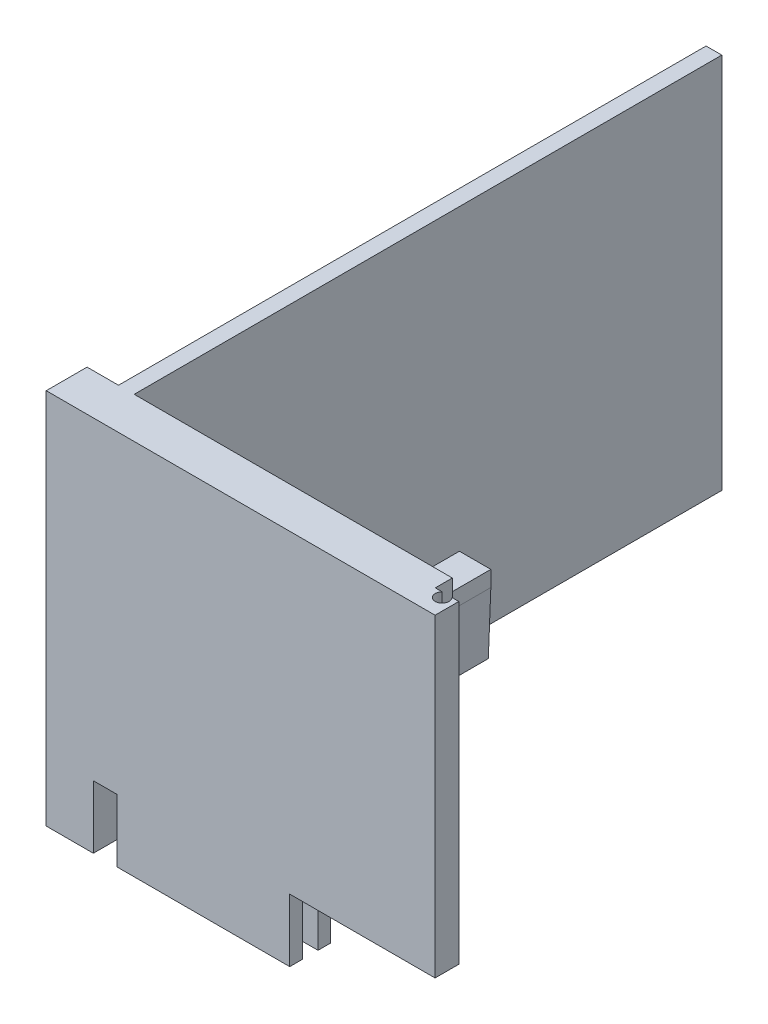
ISO-10303-21;
HEADER;
FILE_DESCRIPTION(('STEP AP214'),'2;1');
FILE_NAME('part.step','',(''),(''),'','','');
FILE_SCHEMA(('AUTOMOTIVE_DESIGN { 1 0 10303 214 1 1 1 1 }'));
ENDSEC;
DATA;
#1=APPLICATION_CONTEXT('core data for automotive mechanical design processes');
#2=APPLICATION_PROTOCOL_DEFINITION('international standard','automotive_design',2000,#1);
#3=PRODUCT_CONTEXT('',#1,'mechanical');
#4=PRODUCT('Part','Part','',(#3));
#5=PRODUCT_RELATED_PRODUCT_CATEGORY('part','',(#4));
#6=PRODUCT_DEFINITION_FORMATION('','',#4);
#7=PRODUCT_DEFINITION_CONTEXT('part definition',#1,'design');
#8=PRODUCT_DEFINITION('design','',#6,#7);
#9=PRODUCT_DEFINITION_SHAPE('','',#8);
#10=(LENGTH_UNIT() NAMED_UNIT(*) SI_UNIT(.MILLI.,.METRE.));
#11=(NAMED_UNIT(*) PLANE_ANGLE_UNIT() SI_UNIT($,.RADIAN.));
#12=(NAMED_UNIT(*) SI_UNIT($,.STERADIAN.) SOLID_ANGLE_UNIT());
#13=UNCERTAINTY_MEASURE_WITH_UNIT(LENGTH_MEASURE(1.E-05),#10,'distance_accuracy_value','');
#14=(GEOMETRIC_REPRESENTATION_CONTEXT(3) GLOBAL_UNCERTAINTY_ASSIGNED_CONTEXT((#13)) GLOBAL_UNIT_ASSIGNED_CONTEXT((#10,
#11,#12)) REPRESENTATION_CONTEXT('',''));
#15=CARTESIAN_POINT('',(0.,0.,0.));
#16=DIRECTION('',(0.,0.,1.));
#17=DIRECTION('',(1.,0.,0.));
#18=AXIS2_PLACEMENT_3D('',#15,#16,#17);
#19=CARTESIAN_POINT('',(0.,76.2,0.));
#20=DIRECTION('',(0.,0.,-1.));
#21=DIRECTION('',(-1.,0.,0.));
#22=AXIS2_PLACEMENT_3D('',#19,#20,#21);
#23=PLANE('',#22);
#24=DIRECTION('',(0.,-1.,0.));
#25=VECTOR('',#24,1.);
#26=CARTESIAN_POINT('',(2.38125,76.2,0.));
#27=LINE('',#26,#25);
#28=CARTESIAN_POINT('',(2.38125,76.2,0.));
#29=VERTEX_POINT('',#28);
#30=CARTESIAN_POINT('',(2.38125,12.7,0.));
#31=VERTEX_POINT('',#30);
#32=EDGE_CURVE('E260',#29,#31,#27,.T.);
#33=ORIENTED_EDGE('',*,*,#32,.F.);
#34=DIRECTION('',(1.,0.,0.));
#35=VECTOR('',#34,1.);
#36=CARTESIAN_POINT('',(0.,76.2,0.));
#37=LINE('',#36,#35);
#38=CARTESIAN_POINT('',(-76.2,76.2,0.));
#39=VERTEX_POINT('',#38);
#40=EDGE_CURVE('E374',#39,#29,#37,.T.);
#41=ORIENTED_EDGE('',*,*,#40,.F.);
#42=DIRECTION('',(0.,-1.,0.));
#43=VECTOR('',#42,1.);
#44=CARTESIAN_POINT('',(-76.2,76.2,0.));
#45=LINE('',#44,#43);
#46=CARTESIAN_POINT('',(-76.2,0.,0.));
#47=VERTEX_POINT('',#46);
#48=EDGE_CURVE('E376',#39,#47,#45,.T.);
#49=ORIENTED_EDGE('',*,*,#48,.T.);
#50=DIRECTION('',(1.,0.,0.));
#51=VECTOR('',#50,1.);
#52=CARTESIAN_POINT('',(0.,0.,0.));
#53=LINE('',#52,#51);
#54=CARTESIAN_POINT('',(-66.675,0.,0.));
#55=VERTEX_POINT('',#54);
#56=EDGE_CURVE('E362',#47,#55,#53,.T.);
#57=ORIENTED_EDGE('',*,*,#56,.T.);
#58=DIRECTION('',(0.,-1.,0.));
#59=VECTOR('',#58,1.);
#60=CARTESIAN_POINT('',(-66.675,12.7,0.));
#61=LINE('',#60,#59);
#62=CARTESIAN_POINT('',(-66.675,12.7,0.));
#63=VERTEX_POINT('',#62);
#64=EDGE_CURVE('E320',#63,#55,#61,.T.);
#65=ORIENTED_EDGE('',*,*,#64,.F.);
#66=DIRECTION('',(-1.,0.,0.));
#67=VECTOR('',#66,1.);
#68=CARTESIAN_POINT('',(0.,12.7,0.));
#69=LINE('',#68,#67);
#70=CARTESIAN_POINT('',(-61.9125,12.7,0.));
#71=VERTEX_POINT('',#70);
#72=EDGE_CURVE('E270',#71,#63,#69,.T.);
#73=ORIENTED_EDGE('',*,*,#72,.F.);
#74=DIRECTION('',(0.,-1.,0.));
#75=VECTOR('',#74,1.);
#76=CARTESIAN_POINT('',(-61.9125,12.7,0.));
#77=LINE('',#76,#75);
#78=CARTESIAN_POINT('',(-61.9125,0.,0.));
#79=VERTEX_POINT('',#78);
#80=EDGE_CURVE('E323',#71,#79,#77,.T.);
#81=ORIENTED_EDGE('',*,*,#80,.T.);
#82=CARTESIAN_POINT('',(-26.9874999999997,0.,0.));
#83=VERTEX_POINT('',#82);
#84=EDGE_CURVE('E398',#79,#83,#53,.T.);
#85=ORIENTED_EDGE('',*,*,#84,.T.);
#86=DIRECTION('',(0.,-1.,0.));
#87=VECTOR('',#86,1.);
#88=CARTESIAN_POINT('',(-26.9874999999997,12.7,0.));
#89=LINE('',#88,#87);
#90=CARTESIAN_POINT('',(-26.9874999999997,12.7,0.));
#91=VERTEX_POINT('',#90);
#92=EDGE_CURVE('E309',#91,#83,#89,.T.);
#93=ORIENTED_EDGE('',*,*,#92,.F.);
#94=DIRECTION('',(-1.,0.,0.));
#95=VECTOR('',#94,1.);
#96=CARTESIAN_POINT('',(0.,12.7,0.));
#97=LINE('',#96,#95);
#98=EDGE_CURVE('E290',#31,#91,#97,.T.);
#99=ORIENTED_EDGE('',*,*,#98,.F.);
#100=EDGE_LOOP('',(#33,#41,#49,#57,#65,#73,#81,#85,#93,#99));
#101=FACE_BOUND('',#100,.T.);
#102=ADVANCED_FACE('F38',(#101),#23,.F.);
#103=CARTESIAN_POINT('',(0.,76.2,0.));
#104=DIRECTION('',(0.,1.,0.));
#105=DIRECTION('',(0.,0.,1.));
#106=AXIS2_PLACEMENT_3D('',#103,#104,#105);
#107=PLANE('',#106);
#108=ORIENTED_EDGE('',*,*,#40,.T.);
#109=DIRECTION('',(0.,0.,1.));
#110=VECTOR('',#109,1.);
#111=CARTESIAN_POINT('',(2.38125,76.2,0.));
#112=LINE('',#111,#110);
#113=CARTESIAN_POINT('',(2.38125,76.2,-4.80139343224575));
#114=VERTEX_POINT('',#113);
#115=EDGE_CURVE('E244',#114,#29,#112,.T.);
#116=ORIENTED_EDGE('',*,*,#115,.F.);
#117=DIRECTION('',(1.,0.,0.));
#118=VECTOR('',#117,1.);
#119=CARTESIAN_POINT('',(0.,76.2,-4.80139343224574));
#120=LINE('',#119,#118);
#121=CARTESIAN_POINT('',(0.984250000000001,76.2,-4.80139343224574));
#122=VERTEX_POINT('',#121);
#123=EDGE_CURVE('E231',#122,#114,#120,.T.);
#124=ORIENTED_EDGE('',*,*,#123,.F.);
#125=CARTESIAN_POINT('',(0.,76.2,-3.81));
#126=DIRECTION('',(0.,1.,0.));
#127=DIRECTION('',(0.,0.,1.));
#128=AXIS2_PLACEMENT_3D('',#125,#126,#127);
#129=CIRCLE('',#128,1.397);
#130=CARTESIAN_POINT('',(-0.98425,76.2,-4.80139343224574));
#131=VERTEX_POINT('',#130);
#132=EDGE_CURVE('E223',#131,#122,#129,.T.);
#133=ORIENTED_EDGE('',*,*,#132,.F.);
#134=DIRECTION('',(1.,0.,0.));
#135=VECTOR('',#134,1.);
#136=CARTESIAN_POINT('',(0.,76.2,-4.80139343224574));
#137=LINE('',#136,#135);
#138=CARTESIAN_POINT('',(-2.38125,76.2,-4.80139343224574));
#139=VERTEX_POINT('',#138);
#140=EDGE_CURVE('E251',#139,#131,#137,.T.);
#141=ORIENTED_EDGE('',*,*,#140,.F.);
#142=DIRECTION('',(0.,0.,-1.));
#143=VECTOR('',#142,1.);
#144=CARTESIAN_POINT('',(-2.38125,76.2,0.));
#145=LINE('',#144,#143);
#146=CARTESIAN_POINT('',(-2.38125,76.2,-8.25499999999999));
#147=VERTEX_POINT('',#146);
#148=EDGE_CURVE('E246',#139,#147,#145,.T.);
#149=ORIENTED_EDGE('',*,*,#148,.T.);
#150=DIRECTION('',(-1.,0.,0.));
#151=VECTOR('',#150,1.);
#152=CARTESIAN_POINT('',(0.,76.2,-8.25499999999999));
#153=LINE('',#152,#151);
#154=CARTESIAN_POINT('',(-66.675,76.2,-8.25499999999999));
#155=VERTEX_POINT('',#154);
#156=EDGE_CURVE('E359',#147,#155,#153,.T.);
#157=ORIENTED_EDGE('',*,*,#156,.T.);
#158=DIRECTION('',(0.,0.,-1.));
#159=VECTOR('',#158,1.);
#160=CARTESIAN_POINT('',(-66.675,76.2,0.));
#161=LINE('',#160,#159);
#162=CARTESIAN_POINT('',(-66.675,76.2,-127.));
#163=VERTEX_POINT('',#162);
#164=EDGE_CURVE('E361',#155,#163,#161,.T.);
#165=ORIENTED_EDGE('',*,*,#164,.T.);
#166=DIRECTION('',(-1.,0.,0.));
#167=VECTOR('',#166,1.);
#168=CARTESIAN_POINT('',(0.,76.2,-127.));
#169=LINE('',#168,#167);
#170=CARTESIAN_POINT('',(-69.85,76.2,-127.));
#171=VERTEX_POINT('',#170);
#172=EDGE_CURVE('E364',#163,#171,#169,.T.);
#173=ORIENTED_EDGE('',*,*,#172,.T.);
#174=DIRECTION('',(0.,0.,1.));
#175=VECTOR('',#174,1.);
#176=CARTESIAN_POINT('',(-69.85,76.2,0.));
#177=LINE('',#176,#175);
#178=CARTESIAN_POINT('',(-69.85,76.2,-8.25499999999998));
#179=VERTEX_POINT('',#178);
#180=EDGE_CURVE('E366',#171,#179,#177,.T.);
#181=ORIENTED_EDGE('',*,*,#180,.T.);
#182=DIRECTION('',(1.,0.,0.));
#183=VECTOR('',#182,1.);
#184=CARTESIAN_POINT('',(0.,76.2,-8.25499999999997));
#185=LINE('',#184,#183);
#186=CARTESIAN_POINT('',(-76.2,76.2,-8.25499999999999));
#187=VERTEX_POINT('',#186);
#188=EDGE_CURVE('E368',#187,#179,#185,.T.);
#189=ORIENTED_EDGE('',*,*,#188,.F.);
#190=DIRECTION('',(0.,0.,-1.));
#191=VECTOR('',#190,1.);
#192=CARTESIAN_POINT('',(-76.2,76.2,0.));
#193=LINE('',#192,#191);
#194=EDGE_CURVE('E371',#39,#187,#193,.T.);
#195=ORIENTED_EDGE('',*,*,#194,.F.);
#196=EDGE_LOOP('',(#108,#116,#124,#133,#141,#149,#157,#165,#173,#181,#189,#195));
#197=FACE_BOUND('',#196,.T.);
#198=ADVANCED_FACE('F243',(#197),#107,.T.);
#199=CARTESIAN_POINT('',(0.,12.7,0.));
#200=DIRECTION('',(0.,-1.,0.));
#201=DIRECTION('',(0.,0.,-1.));
#202=AXIS2_PLACEMENT_3D('',#199,#200,#201);
#203=PLANE('',#202);
#204=DIRECTION('',(1.,0.,0.));
#205=VECTOR('',#204,1.);
#206=CARTESIAN_POINT('',(0.,12.7,-4.80139343224574));
#207=LINE('',#206,#205);
#208=CARTESIAN_POINT('',(0.984250000000001,12.7,-4.80139343224574));
#209=VERTEX_POINT('',#208);
#210=CARTESIAN_POINT('',(2.38125,12.7,-4.80139343224575));
#211=VERTEX_POINT('',#210);
#212=EDGE_CURVE('E46',#209,#211,#207,.T.);
#213=ORIENTED_EDGE('',*,*,#212,.T.);
#214=DIRECTION('',(0.,0.,1.));
#215=VECTOR('',#214,1.);
#216=CARTESIAN_POINT('',(2.38125,12.7,0.));
#217=LINE('',#216,#215);
#218=EDGE_CURVE('E11',#211,#31,#217,.T.);
#219=ORIENTED_EDGE('',*,*,#218,.T.);
#220=ORIENTED_EDGE('',*,*,#98,.T.);
#221=DIRECTION('',(0.,0.,1.));
#222=VECTOR('',#221,1.);
#223=CARTESIAN_POINT('',(-26.9874999999997,12.7,0.));
#224=LINE('',#223,#222);
#225=CARTESIAN_POINT('',(-26.9874999999997,12.7,-2.54000000000001));
#226=VERTEX_POINT('',#225);
#227=EDGE_CURVE('E287',#226,#91,#224,.T.);
#228=ORIENTED_EDGE('',*,*,#227,.F.);
#229=DIRECTION('',(1.,0.,0.));
#230=VECTOR('',#229,1.);
#231=CARTESIAN_POINT('',(0.,12.7,-2.54000000000001));
#232=LINE('',#231,#230);
#233=CARTESIAN_POINT('',(-61.9125,12.7,-2.54000000000001));
#234=VERTEX_POINT('',#233);
#235=EDGE_CURVE('E263',#234,#226,#232,.T.);
#236=ORIENTED_EDGE('',*,*,#235,.F.);
#237=DIRECTION('',(0.,0.,1.));
#238=VECTOR('',#237,1.);
#239=CARTESIAN_POINT('',(-61.9125,12.7,0.));
#240=LINE('',#239,#238);
#241=EDGE_CURVE('E266',#234,#71,#240,.T.);
#242=ORIENTED_EDGE('',*,*,#241,.T.);
#243=ORIENTED_EDGE('',*,*,#72,.T.);
#244=DIRECTION('',(0.,0.,1.));
#245=VECTOR('',#244,1.);
#246=CARTESIAN_POINT('',(-66.675,12.7,0.));
#247=LINE('',#246,#245);
#248=CARTESIAN_POINT('',(-66.675,12.7,-8.25499999999999));
#249=VERTEX_POINT('',#248);
#250=EDGE_CURVE('E273',#249,#63,#247,.T.);
#251=ORIENTED_EDGE('',*,*,#250,.F.);
#252=DIRECTION('',(1.,0.,0.));
#253=VECTOR('',#252,1.);
#254=CARTESIAN_POINT('',(0.,12.7,-8.25499999999999));
#255=LINE('',#254,#253);
#256=CARTESIAN_POINT('',(-61.9125,12.7,-8.25499999999999));
#257=VERTEX_POINT('',#256);
#258=EDGE_CURVE('E275',#249,#257,#255,.T.);
#259=ORIENTED_EDGE('',*,*,#258,.T.);
#260=DIRECTION('',(0.,0.,1.));
#261=VECTOR('',#260,1.);
#262=CARTESIAN_POINT('',(-61.9125,12.7,0.));
#263=LINE('',#262,#261);
#264=CARTESIAN_POINT('',(-61.9125,12.7,-5.71500000000001));
#265=VERTEX_POINT('',#264);
#266=EDGE_CURVE('E278',#257,#265,#263,.T.);
#267=ORIENTED_EDGE('',*,*,#266,.T.);
#268=DIRECTION('',(1.,0.,0.));
#269=VECTOR('',#268,1.);
#270=CARTESIAN_POINT('',(0.,12.7,-5.71500000000001));
#271=LINE('',#270,#269);
#272=CARTESIAN_POINT('',(-26.9874999999997,12.7,-5.71500000000001));
#273=VERTEX_POINT('',#272);
#274=EDGE_CURVE('E281',#265,#273,#271,.T.);
#275=ORIENTED_EDGE('',*,*,#274,.T.);
#276=CARTESIAN_POINT('',(-26.9874999999997,12.7,-8.25499999999999));
#277=VERTEX_POINT('',#276);
#278=EDGE_CURVE('E284',#277,#273,#224,.T.);
#279=ORIENTED_EDGE('',*,*,#278,.F.);
#280=DIRECTION('',(1.,0.,0.));
#281=VECTOR('',#280,1.);
#282=CARTESIAN_POINT('',(0.,12.7,-8.25499999999999));
#283=LINE('',#282,#281);
#284=CARTESIAN_POINT('',(-2.38125,12.7,-8.25499999999999));
#285=VERTEX_POINT('',#284);
#286=EDGE_CURVE('E286',#277,#285,#283,.T.);
#287=ORIENTED_EDGE('',*,*,#286,.T.);
#288=DIRECTION('',(0.,0.,-1.));
#289=VECTOR('',#288,1.);
#290=CARTESIAN_POINT('',(-2.38125,12.7,0.));
#291=LINE('',#290,#289);
#292=CARTESIAN_POINT('',(-2.38125,12.7,-4.80139343224574));
#293=VERTEX_POINT('',#292);
#294=EDGE_CURVE('E435',#293,#285,#291,.T.);
#295=ORIENTED_EDGE('',*,*,#294,.F.);
#296=DIRECTION('',(1.,0.,0.));
#297=VECTOR('',#296,1.);
#298=CARTESIAN_POINT('',(0.,12.7,-4.80139343224574));
#299=LINE('',#298,#297);
#300=CARTESIAN_POINT('',(-0.98425,12.7,-4.80139343224574));
#301=VERTEX_POINT('',#300);
#302=EDGE_CURVE('E432',#293,#301,#299,.T.);
#303=ORIENTED_EDGE('',*,*,#302,.T.);
#304=CARTESIAN_POINT('',(0.,12.7,-3.81));
#305=DIRECTION('',(0.,-1.,0.));
#306=DIRECTION('',(0.,0.,-1.));
#307=AXIS2_PLACEMENT_3D('',#304,#305,#306);
#308=CIRCLE('',#307,1.397);
#309=EDGE_CURVE('E437',#301,#209,#308,.F.);
#310=ORIENTED_EDGE('',*,*,#309,.T.);
#311=EDGE_LOOP('',(#213,#219,#220,#228,#236,#242,#243,#251,#259,#267,#275,#279,#287,#295,#303,#310));
#312=FACE_BOUND('',#311,.T.);
#313=ADVANCED_FACE('F439',(#312),#203,.T.);
#314=CARTESIAN_POINT('',(0.,0.,0.));
#315=DIRECTION('',(0.,1.,0.));
#316=DIRECTION('',(0.,0.,1.));
#317=AXIS2_PLACEMENT_3D('',#314,#315,#316);
#318=PLANE('',#317);
#319=DIRECTION('',(0.,0.,1.));
#320=VECTOR('',#319,1.);
#321=CARTESIAN_POINT('',(-26.9874999999997,0.,0.));
#322=LINE('',#321,#320);
#323=CARTESIAN_POINT('',(-26.9874999999997,0.,-8.25499999999999));
#324=VERTEX_POINT('',#323);
#325=CARTESIAN_POINT('',(-26.9874999999997,0.,-5.71500000000001));
#326=VERTEX_POINT('',#325);
#327=EDGE_CURVE('E302',#324,#326,#322,.T.);
#328=ORIENTED_EDGE('',*,*,#327,.T.);
#329=DIRECTION('',(1.,0.,0.));
#330=VECTOR('',#329,1.);
#331=CARTESIAN_POINT('',(0.,0.,-5.71500000000001));
#332=LINE('',#331,#330);
#333=CARTESIAN_POINT('',(-61.9125,0.,-5.71500000000001));
#334=VERTEX_POINT('',#333);
#335=EDGE_CURVE('E299',#334,#326,#332,.T.);
#336=ORIENTED_EDGE('',*,*,#335,.F.);
#337=DIRECTION('',(0.,0.,1.));
#338=VECTOR('',#337,1.);
#339=CARTESIAN_POINT('',(-61.9125,0.,0.));
#340=LINE('',#339,#338);
#341=CARTESIAN_POINT('',(-61.9125,0.,-8.25499999999999));
#342=VERTEX_POINT('',#341);
#343=EDGE_CURVE('E296',#342,#334,#340,.T.);
#344=ORIENTED_EDGE('',*,*,#343,.F.);
#345=DIRECTION('',(-1.,0.,0.));
#346=VECTOR('',#345,1.);
#347=CARTESIAN_POINT('',(0.,0.,-8.25499999999999));
#348=LINE('',#347,#346);
#349=EDGE_CURVE('E358',#324,#342,#348,.T.);
#350=ORIENTED_EDGE('',*,*,#349,.F.);
#351=EDGE_LOOP('',(#328,#336,#344,#350));
#352=FACE_BOUND('',#351,.T.);
#353=ADVANCED_FACE('F551',(#352),#318,.F.);
#354=DIRECTION('',(0.,0.,-1.));
#355=VECTOR('',#354,1.);
#356=CARTESIAN_POINT('',(-66.675,0.,0.));
#357=LINE('',#356,#355);
#358=CARTESIAN_POINT('',(-66.675,0.,-127.));
#359=VERTEX_POINT('',#358);
#360=EDGE_CURVE('E380',#55,#359,#357,.T.);
#361=ORIENTED_EDGE('',*,*,#360,.F.);
#362=ORIENTED_EDGE('',*,*,#56,.F.);
#363=DIRECTION('',(0.,0.,-1.));
#364=VECTOR('',#363,1.);
#365=CARTESIAN_POINT('',(-76.2,0.,0.));
#366=LINE('',#365,#364);
#367=CARTESIAN_POINT('',(-76.2,0.,-8.25499999999999));
#368=VERTEX_POINT('',#367);
#369=EDGE_CURVE('E395',#47,#368,#366,.T.);
#370=ORIENTED_EDGE('',*,*,#369,.T.);
#371=DIRECTION('',(1.,0.,0.));
#372=VECTOR('',#371,1.);
#373=CARTESIAN_POINT('',(0.,0.,-8.25499999999997));
#374=LINE('',#373,#372);
#375=CARTESIAN_POINT('',(-69.85,0.,-8.25499999999998));
#376=VERTEX_POINT('',#375);
#377=EDGE_CURVE('E392',#368,#376,#374,.T.);
#378=ORIENTED_EDGE('',*,*,#377,.T.);
#379=DIRECTION('',(0.,0.,1.));
#380=VECTOR('',#379,1.);
#381=CARTESIAN_POINT('',(-69.85,0.,0.));
#382=LINE('',#381,#380);
#383=CARTESIAN_POINT('',(-69.85,0.,-127.));
#384=VERTEX_POINT('',#383);
#385=EDGE_CURVE('E389',#384,#376,#382,.T.);
#386=ORIENTED_EDGE('',*,*,#385,.F.);
#387=DIRECTION('',(-1.,0.,0.));
#388=VECTOR('',#387,1.);
#389=CARTESIAN_POINT('',(0.,0.,-127.));
#390=LINE('',#389,#388);
#391=EDGE_CURVE('E382',#359,#384,#390,.T.);
#392=ORIENTED_EDGE('',*,*,#391,.F.);
#393=EDGE_LOOP('',(#361,#362,#370,#378,#386,#392));
#394=FACE_BOUND('',#393,.T.);
#395=ADVANCED_FACE('F684',(#394),#318,.F.);
#396=CARTESIAN_POINT('',(-26.9874999999997,0.,-2.54000000000001));
#397=VERTEX_POINT('',#396);
#398=EDGE_CURVE('E267',#397,#83,#322,.T.);
#399=ORIENTED_EDGE('',*,*,#398,.T.);
#400=ORIENTED_EDGE('',*,*,#84,.F.);
#401=DIRECTION('',(0.,0.,1.));
#402=VECTOR('',#401,1.);
#403=CARTESIAN_POINT('',(-61.9125,0.,0.));
#404=LINE('',#403,#402);
#405=CARTESIAN_POINT('',(-61.9125,0.,-2.54000000000001));
#406=VERTEX_POINT('',#405);
#407=EDGE_CURVE('E294',#406,#79,#404,.T.);
#408=ORIENTED_EDGE('',*,*,#407,.F.);
#409=DIRECTION('',(1.,0.,0.));
#410=VECTOR('',#409,1.);
#411=CARTESIAN_POINT('',(0.,0.,-2.54000000000001));
#412=LINE('',#411,#410);
#413=EDGE_CURVE('E238',#406,#397,#412,.T.);
#414=ORIENTED_EDGE('',*,*,#413,.T.);
#415=EDGE_LOOP('',(#399,#400,#408,#414));
#416=FACE_BOUND('',#415,.T.);
#417=ADVANCED_FACE('F522',(#416),#318,.F.);
#418=CARTESIAN_POINT('',(0.,76.2,-8.25499999999999));
#419=DIRECTION('',(0.,0.,1.));
#420=DIRECTION('',(1.,0.,0.));
#421=AXIS2_PLACEMENT_3D('',#418,#419,#420);
#422=PLANE('',#421);
#423=ORIENTED_EDGE('',*,*,#156,.F.);
#424=DIRECTION('',(0.,-1.,0.));
#425=VECTOR('',#424,1.);
#426=CARTESIAN_POINT('',(-2.38125,76.2,-8.25499999999999));
#427=LINE('',#426,#425);
#428=EDGE_CURVE('E257',#147,#285,#427,.T.);
#429=ORIENTED_EDGE('',*,*,#428,.T.);
#430=ORIENTED_EDGE('',*,*,#286,.F.);
#431=DIRECTION('',(0.,-1.,0.));
#432=VECTOR('',#431,1.);
#433=CARTESIAN_POINT('',(-26.9874999999997,12.7,-8.25499999999999));
#434=LINE('',#433,#432);
#435=EDGE_CURVE('E311',#277,#324,#434,.T.);
#436=ORIENTED_EDGE('',*,*,#435,.T.);
#437=ORIENTED_EDGE('',*,*,#349,.T.);
#438=DIRECTION('',(0.,-1.,0.));
#439=VECTOR('',#438,1.);
#440=CARTESIAN_POINT('',(-61.9125,12.7,-8.25499999999999));
#441=LINE('',#440,#439);
#442=EDGE_CURVE('E318',#257,#342,#441,.T.);
#443=ORIENTED_EDGE('',*,*,#442,.F.);
#444=ORIENTED_EDGE('',*,*,#258,.F.);
#445=DIRECTION('',(0.,-1.,0.));
#446=VECTOR('',#445,1.);
#447=CARTESIAN_POINT('',(-66.675,76.2,-8.25499999999999));
#448=LINE('',#447,#446);
#449=EDGE_CURVE('E424',#155,#249,#448,.T.);
#450=ORIENTED_EDGE('',*,*,#449,.F.);
#451=EDGE_LOOP('',(#423,#429,#430,#436,#437,#443,#444,#450));
#452=FACE_BOUND('',#451,.T.);
#453=ADVANCED_FACE('F40',(#452),#422,.F.);
#454=CARTESIAN_POINT('',(0.,76.2,-61.2775));
#455=DIRECTION('',(0.,0.,-1.));
#456=DIRECTION('',(-1.,0.,0.));
#457=AXIS2_PLACEMENT_3D('',#454,#455,#456);
#458=PLANE('',#457);
#459=DIRECTION('',(0.,-1.,0.));
#460=VECTOR('',#459,1.);
#461=CARTESIAN_POINT('',(-60.325,76.2,-61.2775));
#462=LINE('',#461,#460);
#463=CARTESIAN_POINT('',(-60.3250000000003,15.875,-61.2775));
#464=VERTEX_POINT('',#463);
#465=CARTESIAN_POINT('',(-60.3250000000004,12.7000000000037,-61.2775));
#466=VERTEX_POINT('',#465);
#467=EDGE_CURVE('E418',#464,#466,#462,.T.);
#468=ORIENTED_EDGE('',*,*,#467,.F.);
#469=DIRECTION('',(-1.,0.,0.));
#470=VECTOR('',#469,1.);
#471=CARTESIAN_POINT('',(0.,15.875,-61.2775));
#472=LINE('',#471,#470);
#473=CARTESIAN_POINT('',(-66.6749999999999,15.875,-61.2775));
#474=VERTEX_POINT('',#473);
#475=EDGE_CURVE('E355',#464,#474,#472,.T.);
#476=ORIENTED_EDGE('',*,*,#475,.T.);
#477=DIRECTION('',(0.,-1.,0.));
#478=VECTOR('',#477,1.);
#479=CARTESIAN_POINT('',(-66.675,76.2,-61.2775));
#480=LINE('',#479,#478);
#481=CARTESIAN_POINT('',(-66.6750000000028,12.7,-61.2775));
#482=VERTEX_POINT('',#481);
#483=EDGE_CURVE('E421',#474,#482,#480,.T.);
#484=ORIENTED_EDGE('',*,*,#483,.T.);
#485=DIRECTION('',(1.,0.,0.));
#486=VECTOR('',#485,1.);
#487=CARTESIAN_POINT('',(0.,12.7,-61.2775));
#488=LINE('',#487,#486);
#489=CARTESIAN_POINT('',(-63.5000000000024,12.7,-61.2775));
#490=VERTEX_POINT('',#489);
#491=EDGE_CURVE('E352',#482,#490,#488,.T.);
#492=ORIENTED_EDGE('',*,*,#491,.T.);
#493=DIRECTION('',(-0.0399680383488504,-0.99920095872179,0.));
#494=VECTOR('',#493,1.);
#495=CARTESIAN_POINT('',(-60.8626198083106,78.6345047923311,-61.2775));
#496=LINE('',#495,#494);
#497=CARTESIAN_POINT('',(-64.0080000000022,0.,-61.2775));
#498=VERTEX_POINT('',#497);
#499=EDGE_CURVE('E349',#490,#498,#496,.T.);
#500=ORIENTED_EDGE('',*,*,#499,.T.);
#501=DIRECTION('',(1.,0.,0.));
#502=VECTOR('',#501,1.);
#503=CARTESIAN_POINT('',(0.,0.,-61.2775));
#504=LINE('',#503,#502);
#505=CARTESIAN_POINT('',(-60.8329999999999,0.,-61.2775));
#506=VERTEX_POINT('',#505);
#507=EDGE_CURVE('E379',#498,#506,#504,.T.);
#508=ORIENTED_EDGE('',*,*,#507,.T.);
#509=DIRECTION('',(0.0399680383488439,0.999200958721791,0.));
#510=VECTOR('',#509,1.);
#511=CARTESIAN_POINT('',(-57.6926916932931,78.5077076677301,-61.2775));
#512=LINE('',#511,#510);
#513=EDGE_CURVE('E61',#506,#466,#512,.T.);
#514=ORIENTED_EDGE('',*,*,#513,.T.);
#515=EDGE_LOOP('',(#468,#476,#484,#492,#500,#508,#514));
#516=FACE_BOUND('',#515,.T.);
#517=ADVANCED_FACE('F515',(#516),#458,.F.);
#518=CARTESIAN_POINT('',(-60.325,76.2,0.));
#519=DIRECTION('',(1.,0.,0.));
#520=DIRECTION('',(0.,0.,-1.));
#521=AXIS2_PLACEMENT_3D('',#518,#519,#520);
#522=PLANE('',#521);
#523=DIRECTION('',(0.,0.,-1.));
#524=VECTOR('',#523,1.);
#525=CARTESIAN_POINT('',(-60.3249999999991,15.875,52.4032898291748));
#526=LINE('',#525,#524);
#527=CARTESIAN_POINT('',(-60.3250000000005,15.875,-73.9774999999989));
#528=VERTEX_POINT('',#527);
#529=EDGE_CURVE('E336',#464,#528,#526,.T.);
#530=ORIENTED_EDGE('',*,*,#529,.F.);
#531=ORIENTED_EDGE('',*,*,#467,.T.);
#532=DIRECTION('',(0.,0.,-1.));
#533=VECTOR('',#532,1.);
#534=CARTESIAN_POINT('',(-60.3249999999991,12.7000000000037,52.4032898291748));
#535=LINE('',#534,#533);
#536=CARTESIAN_POINT('',(-60.3250000000005,12.7000000000037,-73.9774999999989));
#537=VERTEX_POINT('',#536);
#538=EDGE_CURVE('E329',#466,#537,#535,.T.);
#539=ORIENTED_EDGE('',*,*,#538,.T.);
#540=DIRECTION('',(0.,-1.,0.));
#541=VECTOR('',#540,1.);
#542=CARTESIAN_POINT('',(-60.325,76.2,-73.9775));
#543=LINE('',#542,#541);
#544=EDGE_CURVE('E415',#528,#537,#543,.T.);
#545=ORIENTED_EDGE('',*,*,#544,.F.);
#546=EDGE_LOOP('',(#530,#531,#539,#545));
#547=FACE_BOUND('',#546,.T.);
#548=ADVANCED_FACE('F512',(#547),#522,.T.);
#549=CARTESIAN_POINT('',(4.85028683883112E-13,76.2,-73.9774999999996));
#550=DIRECTION('',(0.,0.,-1.));
#551=DIRECTION('',(-1.,0.,0.));
#552=AXIS2_PLACEMENT_3D('',#549,#550,#551);
#553=PLANE('',#552);
#554=DIRECTION('',(-1.,0.,0.));
#555=VECTOR('',#554,1.);
#556=CARTESIAN_POINT('',(-8.32623107775285E-13,15.875,-73.9774999999996));
#557=LINE('',#556,#555);
#558=CARTESIAN_POINT('',(-66.675,15.875,-73.9774999999989));
#559=VERTEX_POINT('',#558);
#560=EDGE_CURVE('E333',#528,#559,#557,.T.);
#561=ORIENTED_EDGE('',*,*,#560,.F.);
#562=ORIENTED_EDGE('',*,*,#544,.T.);
#563=DIRECTION('',(0.0399680383488439,0.999200958721791,0.));
#564=VECTOR('',#563,1.);
#565=CARTESIAN_POINT('',(-60.7358226837065,2.42943290734654,-73.9774999999989));
#566=LINE('',#565,#564);
#567=CARTESIAN_POINT('',(-60.8330000000003,0.,-73.9774999999989));
#568=VERTEX_POINT('',#567);
#569=EDGE_CURVE('E308',#568,#537,#566,.T.);
#570=ORIENTED_EDGE('',*,*,#569,.F.);
#571=DIRECTION('',(1.,0.,0.));
#572=VECTOR('',#571,1.);
#573=CARTESIAN_POINT('',(4.85028683883112E-13,0.,-73.9774999999996));
#574=LINE('',#573,#572);
#575=CARTESIAN_POINT('',(-64.0080000000019,0.,-73.9775));
#576=VERTEX_POINT('',#575);
#577=EDGE_CURVE('E383',#576,#568,#574,.T.);
#578=ORIENTED_EDGE('',*,*,#577,.F.);
#579=DIRECTION('',(-0.0399680383488504,-0.99920095872179,0.));
#580=VECTOR('',#579,1.);
#581=CARTESIAN_POINT('',(-63.9057507987244,2.55623003194759,-73.9774999999989));
#582=LINE('',#581,#580);
#583=CARTESIAN_POINT('',(-63.5000000000026,12.7,-73.9774999999989));
#584=VERTEX_POINT('',#583);
#585=EDGE_CURVE('E332',#584,#576,#582,.T.);
#586=ORIENTED_EDGE('',*,*,#585,.F.);
#587=DIRECTION('',(1.,0.,0.));
#588=VECTOR('',#587,1.);
#589=CARTESIAN_POINT('',(-8.32623107775285E-13,12.7,-73.9774999999996));
#590=LINE('',#589,#588);
#591=CARTESIAN_POINT('',(-66.6750000000029,12.7,-73.9774999999989));
#592=VERTEX_POINT('',#591);
#593=EDGE_CURVE('E341',#592,#584,#590,.T.);
#594=ORIENTED_EDGE('',*,*,#593,.F.);
#595=DIRECTION('',(0.,-1.,0.));
#596=VECTOR('',#595,1.);
#597=CARTESIAN_POINT('',(-66.675,76.2,-73.9775));
#598=LINE('',#597,#596);
#599=EDGE_CURVE('E412',#559,#592,#598,.T.);
#600=ORIENTED_EDGE('',*,*,#599,.F.);
#601=EDGE_LOOP('',(#561,#562,#570,#578,#586,#594,#600));
#602=FACE_BOUND('',#601,.T.);
#603=ADVANCED_FACE('F509',(#602),#553,.T.);
#604=CARTESIAN_POINT('',(-66.675,76.2,0.));
#605=DIRECTION('',(-1.,0.,0.));
#606=DIRECTION('',(0.,0.,1.));
#607=AXIS2_PLACEMENT_3D('',#604,#605,#606);
#608=PLANE('',#607);
#609=ORIENTED_EDGE('',*,*,#449,.T.);
#610=ORIENTED_EDGE('',*,*,#250,.T.);
#611=ORIENTED_EDGE('',*,*,#64,.T.);
#612=ORIENTED_EDGE('',*,*,#360,.T.);
#613=DIRECTION('',(0.,-1.,0.));
#614=VECTOR('',#613,1.);
#615=CARTESIAN_POINT('',(-66.675,76.2,-127.));
#616=LINE('',#615,#614);
#617=EDGE_CURVE('E409',#163,#359,#616,.T.);
#618=ORIENTED_EDGE('',*,*,#617,.F.);
#619=ORIENTED_EDGE('',*,*,#164,.F.);
#620=EDGE_LOOP('',(#609,#610,#611,#612,#618,#619));
#621=FACE_BOUND('',#620,.T.);
#622=ORIENTED_EDGE('',*,*,#483,.F.);
#623=DIRECTION('',(0.,0.,-1.));
#624=VECTOR('',#623,1.);
#625=CARTESIAN_POINT('',(-66.6749999999986,15.875,52.4032898291748));
#626=LINE('',#625,#624);
#627=EDGE_CURVE('E337',#474,#559,#626,.T.);
#628=ORIENTED_EDGE('',*,*,#627,.T.);
#629=ORIENTED_EDGE('',*,*,#599,.T.);
#630=DIRECTION('',(0.,0.,-1.));
#631=VECTOR('',#630,1.);
#632=CARTESIAN_POINT('',(-66.6750000000015,12.7,52.4032898291748));
#633=LINE('',#632,#631);
#634=EDGE_CURVE('E344',#482,#592,#633,.T.);
#635=ORIENTED_EDGE('',*,*,#634,.F.);
#636=EDGE_LOOP('',(#622,#628,#629,#635));
#637=FACE_BOUND('',#636,.T.);
#638=ADVANCED_FACE('F455',(#621,#637),#608,.F.);
#639=CARTESIAN_POINT('',(0.,76.2,-127.));
#640=DIRECTION('',(0.,0.,1.));
#641=DIRECTION('',(1.,0.,0.));
#642=AXIS2_PLACEMENT_3D('',#639,#640,#641);
#643=PLANE('',#642);
#644=ORIENTED_EDGE('',*,*,#391,.T.);
#645=DIRECTION('',(0.,-1.,0.));
#646=VECTOR('',#645,1.);
#647=CARTESIAN_POINT('',(-69.85,76.2,-127.));
#648=LINE('',#647,#646);
#649=EDGE_CURVE('E406',#171,#384,#648,.T.);
#650=ORIENTED_EDGE('',*,*,#649,.F.);
#651=ORIENTED_EDGE('',*,*,#172,.F.);
#652=ORIENTED_EDGE('',*,*,#617,.T.);
#653=EDGE_LOOP('',(#644,#650,#651,#652));
#654=FACE_BOUND('',#653,.T.);
#655=ADVANCED_FACE('F463',(#654),#643,.F.);
#656=CARTESIAN_POINT('',(-69.85,76.2,0.));
#657=DIRECTION('',(1.,0.,0.));
#658=DIRECTION('',(0.,0.,-1.));
#659=AXIS2_PLACEMENT_3D('',#656,#657,#658);
#660=PLANE('',#659);
#661=ORIENTED_EDGE('',*,*,#385,.T.);
#662=DIRECTION('',(0.,-1.,0.));
#663=VECTOR('',#662,1.);
#664=CARTESIAN_POINT('',(-69.85,76.2,-8.25499999999998));
#665=LINE('',#664,#663);
#666=EDGE_CURVE('E404',#179,#376,#665,.T.);
#667=ORIENTED_EDGE('',*,*,#666,.F.);
#668=ORIENTED_EDGE('',*,*,#180,.F.);
#669=ORIENTED_EDGE('',*,*,#649,.T.);
#670=EDGE_LOOP('',(#661,#667,#668,#669));
#671=FACE_BOUND('',#670,.T.);
#672=ADVANCED_FACE('F467',(#671),#660,.F.);
#673=CARTESIAN_POINT('',(0.,76.2,-8.25499999999997));
#674=DIRECTION('',(0.,0.,-1.));
#675=DIRECTION('',(-1.,0.,0.));
#676=AXIS2_PLACEMENT_3D('',#673,#674,#675);
#677=PLANE('',#676);
#678=ORIENTED_EDGE('',*,*,#377,.F.);
#679=DIRECTION('',(0.,-1.,0.));
#680=VECTOR('',#679,1.);
#681=CARTESIAN_POINT('',(-76.2,76.2,-8.25499999999999));
#682=LINE('',#681,#680);
#683=EDGE_CURVE('E402',#187,#368,#682,.T.);
#684=ORIENTED_EDGE('',*,*,#683,.F.);
#685=ORIENTED_EDGE('',*,*,#188,.T.);
#686=ORIENTED_EDGE('',*,*,#666,.T.);
#687=EDGE_LOOP('',(#678,#684,#685,#686));
#688=FACE_BOUND('',#687,.T.);
#689=ADVANCED_FACE('F470',(#688),#677,.T.);
#690=CARTESIAN_POINT('',(-76.2,76.2,0.));
#691=DIRECTION('',(-1.,0.,0.));
#692=DIRECTION('',(0.,0.,1.));
#693=AXIS2_PLACEMENT_3D('',#690,#691,#692);
#694=PLANE('',#693);
#695=ORIENTED_EDGE('',*,*,#369,.F.);
#696=ORIENTED_EDGE('',*,*,#48,.F.);
#697=ORIENTED_EDGE('',*,*,#194,.T.);
#698=ORIENTED_EDGE('',*,*,#683,.T.);
#699=EDGE_LOOP('',(#695,#696,#697,#698));
#700=FACE_BOUND('',#699,.T.);
#701=ADVANCED_FACE('F474',(#700),#694,.T.);
#702=ORIENTED_EDGE('',*,*,#507,.F.);
#703=DIRECTION('',(0.,0.,-1.));
#704=VECTOR('',#703,1.);
#705=CARTESIAN_POINT('',(-64.0080000000015,0.,7.19588997442247E-13));
#706=LINE('',#705,#704);
#707=EDGE_CURVE('E429',#498,#576,#706,.T.);
#708=ORIENTED_EDGE('',*,*,#707,.T.);
#709=ORIENTED_EDGE('',*,*,#577,.T.);
#710=DIRECTION('',(0.,0.,1.));
#711=VECTOR('',#710,1.);
#712=CARTESIAN_POINT('',(-60.8329999999995,0.,6.83895098759575E-13));
#713=LINE('',#712,#711);
#714=EDGE_CURVE('E427',#568,#506,#713,.T.);
#715=ORIENTED_EDGE('',*,*,#714,.T.);
#716=EDGE_LOOP('',(#702,#708,#709,#715));
#717=FACE_BOUND('',#716,.T.);
#718=ADVANCED_FACE('F498',(#717),#318,.F.);
#719=CARTESIAN_POINT('',(-60.7358226837051,2.42943290734654,52.4032898291748));
#720=DIRECTION('',(-0.99920095872179,0.0399680383488439,0.));
#721=DIRECTION('',(-0.0399680383488439,-0.999200958721791,0.));
#722=AXIS2_PLACEMENT_3D('',#719,#720,#721);
#723=PLANE('',#722);
#724=ORIENTED_EDGE('',*,*,#714,.F.);
#725=ORIENTED_EDGE('',*,*,#569,.T.);
#726=ORIENTED_EDGE('',*,*,#538,.F.);
#727=ORIENTED_EDGE('',*,*,#513,.F.);
#728=EDGE_LOOP('',(#724,#725,#726,#727));
#729=FACE_BOUND('',#728,.T.);
#730=ADVANCED_FACE('F543',(#729),#723,.F.);
#731=CARTESIAN_POINT('',(5.88171571782464E-13,12.7,52.4032898291741));
#732=DIRECTION('',(0.,1.,0.));
#733=DIRECTION('',(0.,0.,1.));
#734=AXIS2_PLACEMENT_3D('',#731,#732,#733);
#735=PLANE('',#734);
#736=ORIENTED_EDGE('',*,*,#634,.T.);
#737=ORIENTED_EDGE('',*,*,#593,.T.);
#738=DIRECTION('',(0.,0.,-1.));
#739=VECTOR('',#738,1.);
#740=CARTESIAN_POINT('',(-63.5000000000012,12.7,52.4032898291748));
#741=LINE('',#740,#739);
#742=EDGE_CURVE('E339',#490,#584,#741,.T.);
#743=ORIENTED_EDGE('',*,*,#742,.F.);
#744=ORIENTED_EDGE('',*,*,#491,.F.);
#745=EDGE_LOOP('',(#736,#737,#743,#744));
#746=FACE_BOUND('',#745,.T.);
#747=ADVANCED_FACE('F538',(#746),#735,.F.);
#748=CARTESIAN_POINT('',(-63.905750798723,2.55623003194759,52.4032898291748));
#749=DIRECTION('',(0.99920095872179,-0.0399680383488504,0.));
#750=DIRECTION('',(0.0399680383488504,0.99920095872179,0.));
#751=AXIS2_PLACEMENT_3D('',#748,#749,#750);
#752=PLANE('',#751);
#753=ORIENTED_EDGE('',*,*,#742,.T.);
#754=ORIENTED_EDGE('',*,*,#585,.T.);
#755=ORIENTED_EDGE('',*,*,#707,.F.);
#756=ORIENTED_EDGE('',*,*,#499,.F.);
#757=EDGE_LOOP('',(#753,#754,#755,#756));
#758=FACE_BOUND('',#757,.T.);
#759=ADVANCED_FACE('F540',(#758),#752,.F.);
#760=CARTESIAN_POINT('',(5.88171571782464E-13,15.875,52.4032898291741));
#761=DIRECTION('',(0.,-1.,0.));
#762=DIRECTION('',(0.,0.,-1.));
#763=AXIS2_PLACEMENT_3D('',#760,#761,#762);
#764=PLANE('',#763);
#765=ORIENTED_EDGE('',*,*,#529,.T.);
#766=ORIENTED_EDGE('',*,*,#560,.T.);
#767=ORIENTED_EDGE('',*,*,#627,.F.);
#768=ORIENTED_EDGE('',*,*,#475,.F.);
#769=EDGE_LOOP('',(#765,#766,#767,#768));
#770=FACE_BOUND('',#769,.T.);
#771=ADVANCED_FACE('F529',(#770),#764,.F.);
#772=CARTESIAN_POINT('',(0.,12.7,-2.54000000000001));
#773=DIRECTION('',(0.,0.,-1.));
#774=DIRECTION('',(-1.,0.,0.));
#775=AXIS2_PLACEMENT_3D('',#772,#773,#774);
#776=PLANE('',#775);
#777=ORIENTED_EDGE('',*,*,#413,.F.);
#778=DIRECTION('',(0.,-1.,0.));
#779=VECTOR('',#778,1.);
#780=CARTESIAN_POINT('',(-61.9125,12.7,-2.54000000000001));
#781=LINE('',#780,#779);
#782=EDGE_CURVE('E326',#234,#406,#781,.T.);
#783=ORIENTED_EDGE('',*,*,#782,.F.);
#784=ORIENTED_EDGE('',*,*,#235,.T.);
#785=DIRECTION('',(0.,-1.,0.));
#786=VECTOR('',#785,1.);
#787=CARTESIAN_POINT('',(-26.9874999999997,12.7,-2.54000000000001));
#788=LINE('',#787,#786);
#789=EDGE_CURVE('E305',#226,#397,#788,.T.);
#790=ORIENTED_EDGE('',*,*,#789,.T.);
#791=EDGE_LOOP('',(#777,#783,#784,#790));
#792=FACE_BOUND('',#791,.T.);
#793=ADVANCED_FACE('F554',(#792),#776,.T.);
#794=CARTESIAN_POINT('',(-26.9874999999997,12.7,0.));
#795=DIRECTION('',(1.,0.,0.));
#796=DIRECTION('',(0.,0.,-1.));
#797=AXIS2_PLACEMENT_3D('',#794,#795,#796);
#798=PLANE('',#797);
#799=ORIENTED_EDGE('',*,*,#398,.F.);
#800=ORIENTED_EDGE('',*,*,#789,.F.);
#801=ORIENTED_EDGE('',*,*,#227,.T.);
#802=ORIENTED_EDGE('',*,*,#92,.T.);
#803=EDGE_LOOP('',(#799,#800,#801,#802));
#804=FACE_BOUND('',#803,.T.);
#805=ADVANCED_FACE('F574',(#804),#798,.T.);
#806=ORIENTED_EDGE('',*,*,#327,.F.);
#807=ORIENTED_EDGE('',*,*,#435,.F.);
#808=ORIENTED_EDGE('',*,*,#278,.T.);
#809=DIRECTION('',(0.,-1.,0.));
#810=VECTOR('',#809,1.);
#811=CARTESIAN_POINT('',(-26.9874999999997,12.7,-5.71500000000001));
#812=LINE('',#811,#810);
#813=EDGE_CURVE('E314',#273,#326,#812,.T.);
#814=ORIENTED_EDGE('',*,*,#813,.T.);
#815=EDGE_LOOP('',(#806,#807,#808,#814));
#816=FACE_BOUND('',#815,.T.);
#817=ADVANCED_FACE('F582',(#816),#798,.T.);
#818=CARTESIAN_POINT('',(0.,12.7,-5.71500000000001));
#819=DIRECTION('',(0.,0.,-1.));
#820=DIRECTION('',(-1.,0.,0.));
#821=AXIS2_PLACEMENT_3D('',#818,#819,#820);
#822=PLANE('',#821);
#823=ORIENTED_EDGE('',*,*,#335,.T.);
#824=ORIENTED_EDGE('',*,*,#813,.F.);
#825=ORIENTED_EDGE('',*,*,#274,.F.);
#826=DIRECTION('',(0.,-1.,0.));
#827=VECTOR('',#826,1.);
#828=CARTESIAN_POINT('',(-61.9125,12.7,-5.71500000000001));
#829=LINE('',#828,#827);
#830=EDGE_CURVE('E316',#265,#334,#829,.T.);
#831=ORIENTED_EDGE('',*,*,#830,.T.);
#832=EDGE_LOOP('',(#823,#824,#825,#831));
#833=FACE_BOUND('',#832,.T.);
#834=ADVANCED_FACE('F590',(#833),#822,.F.);
#835=CARTESIAN_POINT('',(-61.9125,12.7,0.));
#836=DIRECTION('',(1.,0.,0.));
#837=DIRECTION('',(0.,0.,-1.));
#838=AXIS2_PLACEMENT_3D('',#835,#836,#837);
#839=PLANE('',#838);
#840=ORIENTED_EDGE('',*,*,#343,.T.);
#841=ORIENTED_EDGE('',*,*,#830,.F.);
#842=ORIENTED_EDGE('',*,*,#266,.F.);
#843=ORIENTED_EDGE('',*,*,#442,.T.);
#844=EDGE_LOOP('',(#840,#841,#842,#843));
#845=FACE_BOUND('',#844,.T.);
#846=ADVANCED_FACE('F597',(#845),#839,.F.);
#847=CARTESIAN_POINT('',(-61.9125,12.7,0.));
#848=DIRECTION('',(1.,0.,0.));
#849=DIRECTION('',(0.,0.,-1.));
#850=AXIS2_PLACEMENT_3D('',#847,#848,#849);
#851=PLANE('',#850);
#852=ORIENTED_EDGE('',*,*,#407,.T.);
#853=ORIENTED_EDGE('',*,*,#80,.F.);
#854=ORIENTED_EDGE('',*,*,#241,.F.);
#855=ORIENTED_EDGE('',*,*,#782,.T.);
#856=EDGE_LOOP('',(#852,#853,#854,#855));
#857=FACE_BOUND('',#856,.T.);
#858=ADVANCED_FACE('F605',(#857),#851,.F.);
#859=CARTESIAN_POINT('',(0.,76.2,-3.81));
#860=DIRECTION('',(0.,-1.,0.));
#861=DIRECTION('',(0.,0.,-1.));
#862=AXIS2_PLACEMENT_3D('',#859,#860,#861);
#863=CYLINDRICAL_SURFACE('',#862,1.397);
#864=DIRECTION('',(0.,-1.,0.));
#865=VECTOR('',#864,1.);
#866=CARTESIAN_POINT('',(-0.98425,76.2,-4.80139343224574));
#867=LINE('',#866,#865);
#868=EDGE_CURVE('E53',#131,#301,#867,.T.);
#869=ORIENTED_EDGE('',*,*,#868,.F.);
#870=ORIENTED_EDGE('',*,*,#132,.T.);
#871=DIRECTION('',(0.,-1.,0.));
#872=VECTOR('',#871,1.);
#873=CARTESIAN_POINT('',(0.984250000000001,76.2,-4.80139343224574));
#874=LINE('',#873,#872);
#875=EDGE_CURVE('E226',#122,#209,#874,.T.);
#876=ORIENTED_EDGE('',*,*,#875,.T.);
#877=ORIENTED_EDGE('',*,*,#309,.F.);
#878=EDGE_LOOP('',(#869,#870,#876,#877));
#879=FACE_BOUND('',#878,.T.);
#880=ADVANCED_FACE('F225',(#879),#863,.F.);
#881=CARTESIAN_POINT('',(0.,76.2,-4.80139343224574));
#882=DIRECTION('',(0.,0.,-1.));
#883=DIRECTION('',(-1.,0.,0.));
#884=AXIS2_PLACEMENT_3D('',#881,#882,#883);
#885=PLANE('',#884);
#886=ORIENTED_EDGE('',*,*,#875,.F.);
#887=ORIENTED_EDGE('',*,*,#123,.T.);
#888=DIRECTION('',(0.,-1.,0.));
#889=VECTOR('',#888,1.);
#890=CARTESIAN_POINT('',(2.38125,76.2,-4.80139343224575));
#891=LINE('',#890,#889);
#892=EDGE_CURVE('E239',#114,#211,#891,.T.);
#893=ORIENTED_EDGE('',*,*,#892,.T.);
#894=ORIENTED_EDGE('',*,*,#212,.F.);
#895=EDGE_LOOP('',(#886,#887,#893,#894));
#896=FACE_BOUND('',#895,.T.);
#897=ADVANCED_FACE('F234',(#896),#885,.T.);
#898=CARTESIAN_POINT('',(2.38125,76.2,0.));
#899=DIRECTION('',(1.,0.,0.));
#900=DIRECTION('',(0.,0.,-1.));
#901=AXIS2_PLACEMENT_3D('',#898,#899,#900);
#902=PLANE('',#901);
#903=ORIENTED_EDGE('',*,*,#892,.F.);
#904=ORIENTED_EDGE('',*,*,#115,.T.);
#905=ORIENTED_EDGE('',*,*,#32,.T.);
#906=ORIENTED_EDGE('',*,*,#218,.F.);
#907=EDGE_LOOP('',(#903,#904,#905,#906));
#908=FACE_BOUND('',#907,.T.);
#909=ADVANCED_FACE('F481',(#908),#902,.T.);
#910=CARTESIAN_POINT('',(-2.38125,76.2,0.));
#911=DIRECTION('',(-1.,0.,0.));
#912=DIRECTION('',(0.,0.,1.));
#913=AXIS2_PLACEMENT_3D('',#910,#911,#912);
#914=PLANE('',#913);
#915=ORIENTED_EDGE('',*,*,#294,.T.);
#916=ORIENTED_EDGE('',*,*,#428,.F.);
#917=ORIENTED_EDGE('',*,*,#148,.F.);
#918=DIRECTION('',(0.,-1.,0.));
#919=VECTOR('',#918,1.);
#920=CARTESIAN_POINT('',(-2.38125,76.2,-4.80139343224574));
#921=LINE('',#920,#919);
#922=EDGE_CURVE('E254',#139,#293,#921,.T.);
#923=ORIENTED_EDGE('',*,*,#922,.T.);
#924=EDGE_LOOP('',(#915,#916,#917,#923));
#925=FACE_BOUND('',#924,.T.);
#926=ADVANCED_FACE('F445',(#925),#914,.F.);
#927=CARTESIAN_POINT('',(0.,76.2,-4.80139343224574));
#928=DIRECTION('',(0.,0.,-1.));
#929=DIRECTION('',(-1.,0.,0.));
#930=AXIS2_PLACEMENT_3D('',#927,#928,#929);
#931=PLANE('',#930);
#932=ORIENTED_EDGE('',*,*,#922,.F.);
#933=ORIENTED_EDGE('',*,*,#140,.T.);
#934=ORIENTED_EDGE('',*,*,#868,.T.);
#935=ORIENTED_EDGE('',*,*,#302,.F.);
#936=EDGE_LOOP('',(#932,#933,#934,#935));
#937=FACE_BOUND('',#936,.T.);
#938=ADVANCED_FACE('F442',(#937),#931,.T.);
#939=CLOSED_SHELL('',(#102,#198,#313,#353,#395,#417,#453,#517,#548,#603,#638,#655,#672,#689,
#701,#718,#730,#747,#759,#771,#793,#805,#817,#834,#846,#858,#880,#897,#909,#926,#938));
#940=MANIFOLD_SOLID_BREP('B2',#939);
#941=ADVANCED_BREP_SHAPE_REPRESENTATION('',(#18,#940),#14);
#942=SHAPE_DEFINITION_REPRESENTATION(#9,#941);
ENDSEC;
END-ISO-10303-21;
